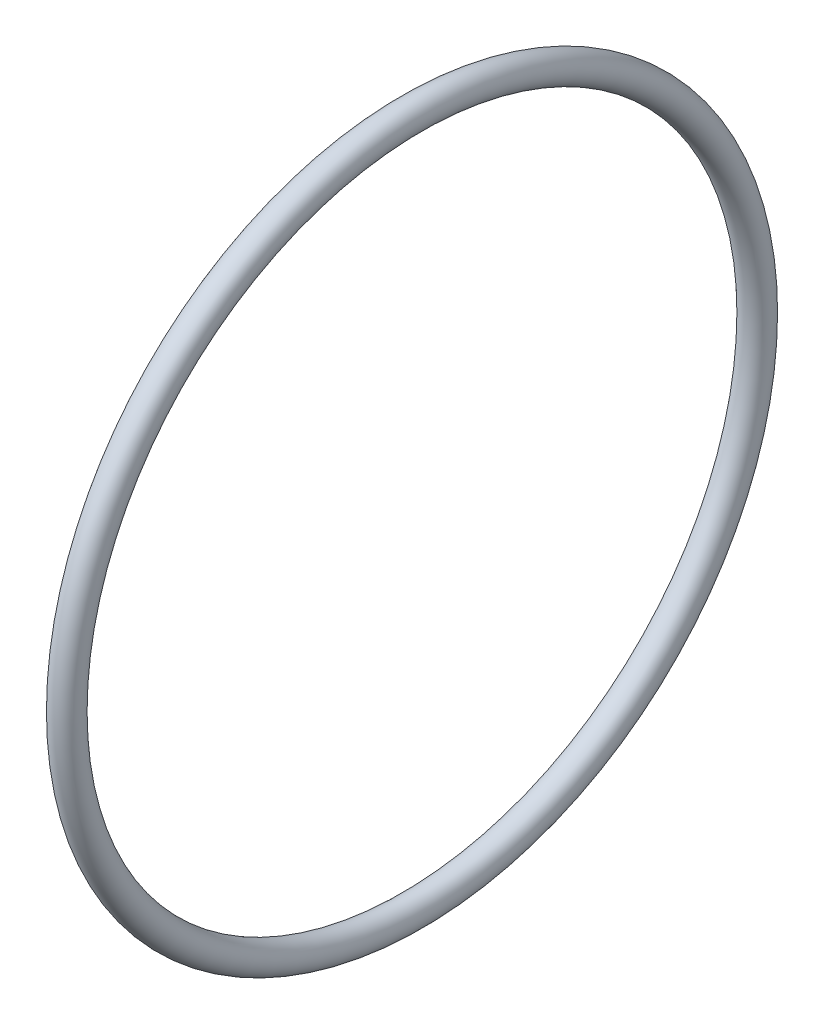
ISO-10303-21;
HEADER;
FILE_DESCRIPTION(('STEP AP214'),'2;1');
FILE_NAME('part.step','',(''),(''),'','','');
FILE_SCHEMA(('AUTOMOTIVE_DESIGN { 1 0 10303 214 1 1 1 1 }'));
ENDSEC;
DATA;
#1=APPLICATION_CONTEXT('core data for automotive mechanical design processes');
#2=APPLICATION_PROTOCOL_DEFINITION('international standard','automotive_design',2000,#1);
#3=PRODUCT_CONTEXT('',#1,'mechanical');
#4=PRODUCT('Part','Part','',(#3));
#5=PRODUCT_RELATED_PRODUCT_CATEGORY('part','',(#4));
#6=PRODUCT_DEFINITION_FORMATION('','',#4);
#7=PRODUCT_DEFINITION_CONTEXT('part definition',#1,'design');
#8=PRODUCT_DEFINITION('design','',#6,#7);
#9=PRODUCT_DEFINITION_SHAPE('','',#8);
#10=(LENGTH_UNIT() NAMED_UNIT(*) SI_UNIT(.MILLI.,.METRE.));
#11=(NAMED_UNIT(*) PLANE_ANGLE_UNIT() SI_UNIT($,.RADIAN.));
#12=(NAMED_UNIT(*) SI_UNIT($,.STERADIAN.) SOLID_ANGLE_UNIT());
#13=UNCERTAINTY_MEASURE_WITH_UNIT(LENGTH_MEASURE(1.E-05),#10,'distance_accuracy_value','');
#14=(GEOMETRIC_REPRESENTATION_CONTEXT(3) GLOBAL_UNCERTAINTY_ASSIGNED_CONTEXT((#13)) GLOBAL_UNIT_ASSIGNED_CONTEXT((#10,
#11,#12)) REPRESENTATION_CONTEXT('',''));
#15=CARTESIAN_POINT('',(0.,0.,0.));
#16=DIRECTION('',(0.,0.,1.));
#17=DIRECTION('',(1.,0.,0.));
#18=AXIS2_PLACEMENT_3D('',#15,#16,#17);
#19=CARTESIAN_POINT('',(0.,0.,0.));
#20=DIRECTION('',(-1.,0.,0.));
#21=DIRECTION('',(0.,0.,1.));
#22=AXIS2_PLACEMENT_3D('',#19,#20,#21);
#23=TOROIDAL_SURFACE('',#22,48.,2.);
#24=CARTESIAN_POINT('',(0.,0.,50.));
#25=VERTEX_POINT('',#24);
#26=VERTEX_LOOP('',#25);
#27=FACE_BOUND('',#26,.T.);
#28=ADVANCED_FACE('F28',(#27),#23,.T.);
#29=CLOSED_SHELL('',(#28));
#30=MANIFOLD_SOLID_BREP('B2',#29);
#31=ADVANCED_BREP_SHAPE_REPRESENTATION('',(#18,#30),#14);
#32=SHAPE_DEFINITION_REPRESENTATION(#9,#31);
ENDSEC;
END-ISO-10303-21;
